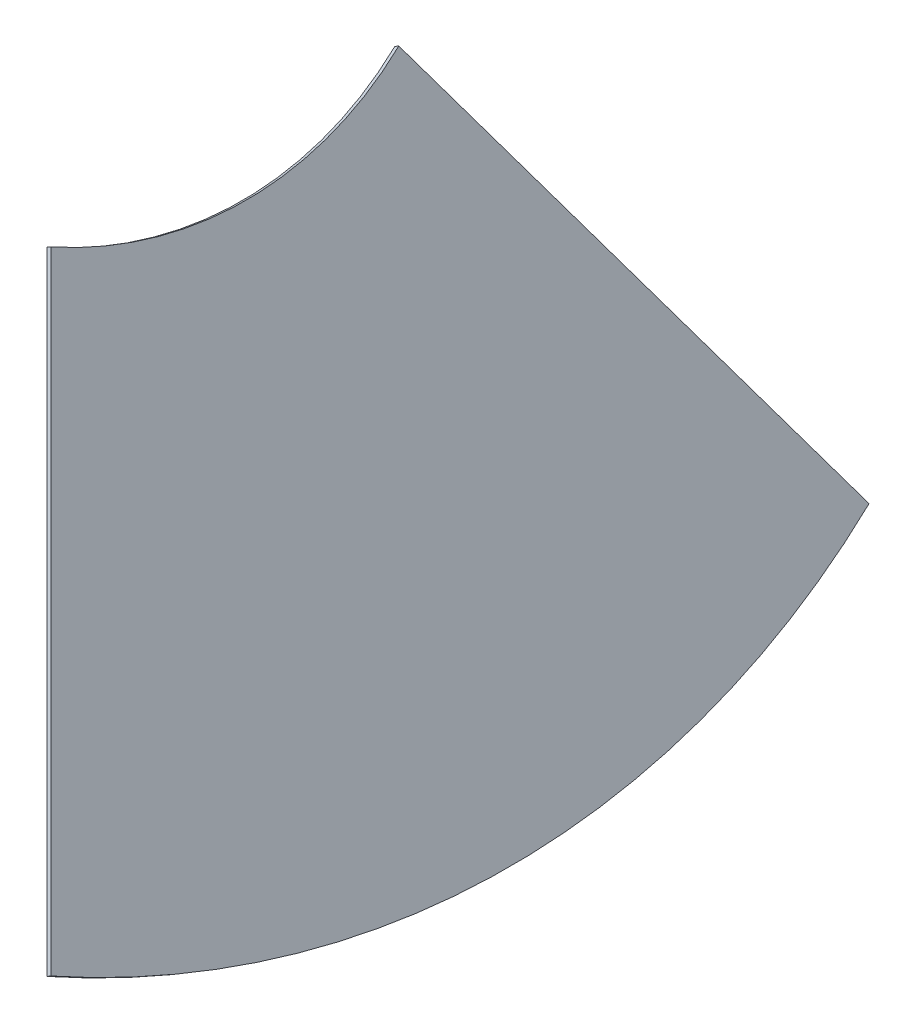
ISO-10303-21;
HEADER;
FILE_DESCRIPTION(('STEP AP214'),'2;1');
FILE_NAME('part.step','',(''),(''),'','','');
FILE_SCHEMA(('AUTOMOTIVE_DESIGN { 1 0 10303 214 1 1 1 1 }'));
ENDSEC;
DATA;
#1=APPLICATION_CONTEXT('core data for automotive mechanical design processes');
#2=APPLICATION_PROTOCOL_DEFINITION('international standard','automotive_design',2000,#1);
#3=PRODUCT_CONTEXT('',#1,'mechanical');
#4=PRODUCT('Part','Part','',(#3));
#5=PRODUCT_RELATED_PRODUCT_CATEGORY('part','',(#4));
#6=PRODUCT_DEFINITION_FORMATION('','',#4);
#7=PRODUCT_DEFINITION_CONTEXT('part definition',#1,'design');
#8=PRODUCT_DEFINITION('design','',#6,#7);
#9=PRODUCT_DEFINITION_SHAPE('','',#8);
#10=(LENGTH_UNIT() NAMED_UNIT(*) SI_UNIT(.MILLI.,.METRE.));
#11=(NAMED_UNIT(*) PLANE_ANGLE_UNIT() SI_UNIT($,.RADIAN.));
#12=(NAMED_UNIT(*) SI_UNIT($,.STERADIAN.) SOLID_ANGLE_UNIT());
#13=UNCERTAINTY_MEASURE_WITH_UNIT(LENGTH_MEASURE(1.E-05),#10,'distance_accuracy_value','');
#14=(GEOMETRIC_REPRESENTATION_CONTEXT(3) GLOBAL_UNCERTAINTY_ASSIGNED_CONTEXT((#13)) GLOBAL_UNIT_ASSIGNED_CONTEXT((#10,
#11,#12)) REPRESENTATION_CONTEXT('',''));
#15=CARTESIAN_POINT('',(0.,0.,0.));
#16=DIRECTION('',(0.,0.,1.));
#17=DIRECTION('',(1.,0.,0.));
#18=AXIS2_PLACEMENT_3D('',#15,#16,#17);
#19=CARTESIAN_POINT('',(1.7822324197882,83.9507675123243,1.04083408558608E-12));
#20=DIRECTION('',(0.860012120645903,0.51027360537474,0.));
#21=DIRECTION('',(-0.51027360537474,0.860012120645903,0.));
#22=AXIS2_PLACEMENT_3D('',#19,#20,#21);
#23=CYLINDRICAL_SURFACE('',#22,166.296697492707);
#24=DIRECTION('',(-0.860012120645903,-0.51027360537474,0.));
#25=VECTOR('',#24,1.);
#26=CARTESIAN_POINT('',(77.3673205027597,-43.4398935110014,75.585088082971));
#27=LINE('',#26,#25);
#28=CARTESIAN_POINT('',(78.2273326234056,-42.9296199056267,75.585088082971));
#29=VERTEX_POINT('',#28);
#30=CARTESIAN_POINT('',(76.5073083821138,-43.9501671163762,75.585088082971));
#31=VERTEX_POINT('',#30);
#32=EDGE_CURVE('E11',#29,#31,#27,.T.);
#33=ORIENTED_EDGE('',*,*,#32,.F.);
#34=CARTESIAN_POINT('',(2.6422445404341,84.461041117699,1.04193098884735E-12));
#35=DIRECTION('',(0.860012120645903,0.51027360537474,0.));
#36=DIRECTION('',(-0.51027360537474,0.860012120645903,0.));
#37=AXIS2_PLACEMENT_3D('',#34,#35,#36);
#38=CIRCLE('',#37,166.296697492707);
#39=CARTESIAN_POINT('',(78.2273326234056,-42.9296199056263,-75.5850880829697));
#40=VERTEX_POINT('',#39);
#41=EDGE_CURVE('E95',#29,#40,#38,.T.);
#42=ORIENTED_EDGE('',*,*,#41,.T.);
#43=DIRECTION('',(-0.860012120645903,-0.51027360537474,0.));
#44=VECTOR('',#43,1.);
#45=CARTESIAN_POINT('',(77.3673205027597,-43.439893511001,-75.5850880829696));
#46=LINE('',#45,#44);
#47=CARTESIAN_POINT('',(76.5073083821138,-43.9501671163758,-75.5850880829697));
#48=VERTEX_POINT('',#47);
#49=EDGE_CURVE('E50',#40,#48,#46,.T.);
#50=ORIENTED_EDGE('',*,*,#49,.T.);
#51=CARTESIAN_POINT('',(0.922220299142295,83.4404939069495,1.03973718232481E-12));
#52=DIRECTION('',(0.860012120645903,0.51027360537474,0.));
#53=DIRECTION('',(-0.51027360537474,0.860012120645903,0.));
#54=AXIS2_PLACEMENT_3D('',#51,#52,#53);
#55=CIRCLE('',#54,166.296697492707);
#56=EDGE_CURVE('E108',#31,#48,#55,.T.);
#57=ORIENTED_EDGE('',*,*,#56,.F.);
#58=EDGE_LOOP('',(#33,#42,#50,#57));
#59=FACE_BOUND('',#58,.T.);
#60=ADVANCED_FACE('F40',(#59),#23,.F.);
#61=CARTESIAN_POINT('',(179.546731982559,-215.652470112052,-177.764499562767));
#62=DIRECTION('',(0.231929292584756,-0.390892259867602,0.890736798620521));
#63=DIRECTION('',(0.454519477672048,-0.766044443118977,-0.454519477672042));
#64=AXIS2_PLACEMENT_3D('',#61,#62,#63);
#65=PLANE('',#64);
#66=ORIENTED_EDGE('',*,*,#49,.F.);
#67=DIRECTION('',(0.454519477672048,-0.766044443118977,-0.454519477672042));
#68=VECTOR('',#67,1.);
#69=CARTESIAN_POINT('',(180.406744103204,-215.142196506677,-177.764499562767));
#70=LINE('',#69,#68);
#71=CARTESIAN_POINT('',(180.406744103204,-215.142196506678,-177.764499562767));
#72=VERTEX_POINT('',#71);
#73=EDGE_CURVE('E102',#40,#72,#70,.T.);
#74=ORIENTED_EDGE('',*,*,#73,.T.);
#75=DIRECTION('',(-0.860012120645903,-0.51027360537474,0.));
#76=VECTOR('',#75,1.);
#77=CARTESIAN_POINT('',(179.546731982559,-215.652470112052,-177.764499562767));
#78=LINE('',#77,#76);
#79=CARTESIAN_POINT('',(178.686719861913,-216.162743717427,-177.764499562767));
#80=VERTEX_POINT('',#79);
#81=EDGE_CURVE('E58',#72,#80,#78,.T.);
#82=ORIENTED_EDGE('',*,*,#81,.T.);
#83=DIRECTION('',(0.454519477672048,-0.766044443118977,-0.454519477672042));
#84=VECTOR('',#83,1.);
#85=CARTESIAN_POINT('',(178.686719861913,-216.162743717427,-177.764499562767));
#86=LINE('',#85,#84);
#87=EDGE_CURVE('E89',#48,#80,#86,.T.);
#88=ORIENTED_EDGE('',*,*,#87,.F.);
#89=EDGE_LOOP('',(#66,#74,#82,#88));
#90=FACE_BOUND('',#89,.T.);
#91=ADVANCED_FACE('F112',(#90),#65,.F.);
#92=CARTESIAN_POINT('',(1.78223241978553,83.9507675123288,-2.35922392732846E-13));
#93=DIRECTION('',(0.860012120645903,0.51027360537474,0.));
#94=DIRECTION('',(-0.51027360537474,0.860012120645903,0.));
#95=AXIS2_PLACEMENT_3D('',#92,#93,#94);
#96=CYLINDRICAL_SURFACE('',#95,391.104250302417);
#97=ORIENTED_EDGE('',*,*,#81,.F.);
#98=CARTESIAN_POINT('',(2.64224454043143,84.4610411177035,-2.34825489471577E-13));
#99=DIRECTION('',(-0.860012120645903,-0.51027360537474,0.));
#100=DIRECTION('',(0.51027360537474,-0.860012120645903,0.));
#101=AXIS2_PLACEMENT_3D('',#98,#99,#100);
#102=CIRCLE('',#101,391.104250302417);
#103=CARTESIAN_POINT('',(180.406744103204,-215.142196506677,177.764499562768));
#104=VERTEX_POINT('',#103);
#105=EDGE_CURVE('E94',#72,#104,#102,.T.);
#106=ORIENTED_EDGE('',*,*,#105,.T.);
#107=DIRECTION('',(-0.860012120645903,-0.51027360537474,0.));
#108=VECTOR('',#107,1.);
#109=CARTESIAN_POINT('',(179.546731982558,-215.652470112052,177.764499562768));
#110=LINE('',#109,#108);
#111=CARTESIAN_POINT('',(178.686719861912,-216.162743717427,177.764499562768));
#112=VERTEX_POINT('',#111);
#113=EDGE_CURVE('E44',#104,#112,#110,.T.);
#114=ORIENTED_EDGE('',*,*,#113,.T.);
#115=CARTESIAN_POINT('',(0.922220299139623,83.440493906954,-2.37019295994115E-13));
#116=DIRECTION('',(-0.860012120645903,-0.51027360537474,0.));
#117=DIRECTION('',(0.51027360537474,-0.860012120645903,0.));
#118=AXIS2_PLACEMENT_3D('',#115,#116,#117);
#119=CIRCLE('',#118,391.104250302417);
#120=EDGE_CURVE('E104',#80,#112,#119,.T.);
#121=ORIENTED_EDGE('',*,*,#120,.F.);
#122=EDGE_LOOP('',(#97,#106,#114,#121));
#123=FACE_BOUND('',#122,.T.);
#124=ADVANCED_FACE('F97',(#123),#96,.T.);
#125=CARTESIAN_POINT('',(179.546731982558,-215.652470112052,177.764499562768));
#126=DIRECTION('',(0.231929292584758,-0.390892259867602,-0.89073679862052));
#127=DIRECTION('',(-0.454519477672046,0.766044443118977,-0.454519477672043));
#128=AXIS2_PLACEMENT_3D('',#125,#126,#127);
#129=PLANE('',#128);
#130=DIRECTION('',(-0.454519477672046,0.766044443118977,-0.454519477672043));
#131=VECTOR('',#130,1.);
#132=CARTESIAN_POINT('',(180.406744103204,-215.142196506677,177.764499562768));
#133=LINE('',#132,#131);
#134=EDGE_CURVE('E83',#104,#29,#133,.T.);
#135=ORIENTED_EDGE('',*,*,#134,.T.);
#136=ORIENTED_EDGE('',*,*,#32,.T.);
#137=DIRECTION('',(-0.454519477672046,0.766044443118977,-0.454519477672043));
#138=VECTOR('',#137,1.);
#139=CARTESIAN_POINT('',(178.686719861912,-216.162743717427,177.764499562768));
#140=LINE('',#139,#138);
#141=EDGE_CURVE('E85',#112,#31,#140,.T.);
#142=ORIENTED_EDGE('',*,*,#141,.F.);
#143=ORIENTED_EDGE('',*,*,#113,.F.);
#144=EDGE_LOOP('',(#135,#136,#142,#143));
#145=FACE_BOUND('',#144,.T.);
#146=ADVANCED_FACE('F42',(#145),#129,.F.);
#147=CARTESIAN_POINT('',(0.922220299139624,83.440493906954,-2.37019295994115E-13));
#148=DIRECTION('',(0.860012120645903,0.51027360537474,0.));
#149=DIRECTION('',(-0.51027360537474,0.860012120645903,0.));
#150=AXIS2_PLACEMENT_3D('',#147,#148,#149);
#151=PLANE('',#150);
#152=ORIENTED_EDGE('',*,*,#120,.T.);
#153=ORIENTED_EDGE('',*,*,#141,.T.);
#154=ORIENTED_EDGE('',*,*,#56,.T.);
#155=ORIENTED_EDGE('',*,*,#87,.T.);
#156=EDGE_LOOP('',(#152,#153,#154,#155));
#157=FACE_BOUND('',#156,.T.);
#158=ADVANCED_FACE('F111',(#157),#151,.F.);
#159=CARTESIAN_POINT('',(2.64224454043143,84.4610411177035,-2.34825489471577E-13));
#160=DIRECTION('',(0.860012120645903,0.51027360537474,0.));
#161=DIRECTION('',(-0.51027360537474,0.860012120645903,0.));
#162=AXIS2_PLACEMENT_3D('',#159,#160,#161);
#163=PLANE('',#162);
#164=ORIENTED_EDGE('',*,*,#105,.F.);
#165=ORIENTED_EDGE('',*,*,#73,.F.);
#166=ORIENTED_EDGE('',*,*,#41,.F.);
#167=ORIENTED_EDGE('',*,*,#134,.F.);
#168=EDGE_LOOP('',(#164,#165,#166,#167));
#169=FACE_BOUND('',#168,.T.);
#170=ADVANCED_FACE('F92',(#169),#163,.T.);
#171=CLOSED_SHELL('',(#60,#91,#124,#146,#158,#170));
#172=MANIFOLD_SOLID_BREP('B2',#171);
#173=ADVANCED_BREP_SHAPE_REPRESENTATION('',(#18,#172),#14);
#174=SHAPE_DEFINITION_REPRESENTATION(#9,#173);
ENDSEC;
END-ISO-10303-21;
